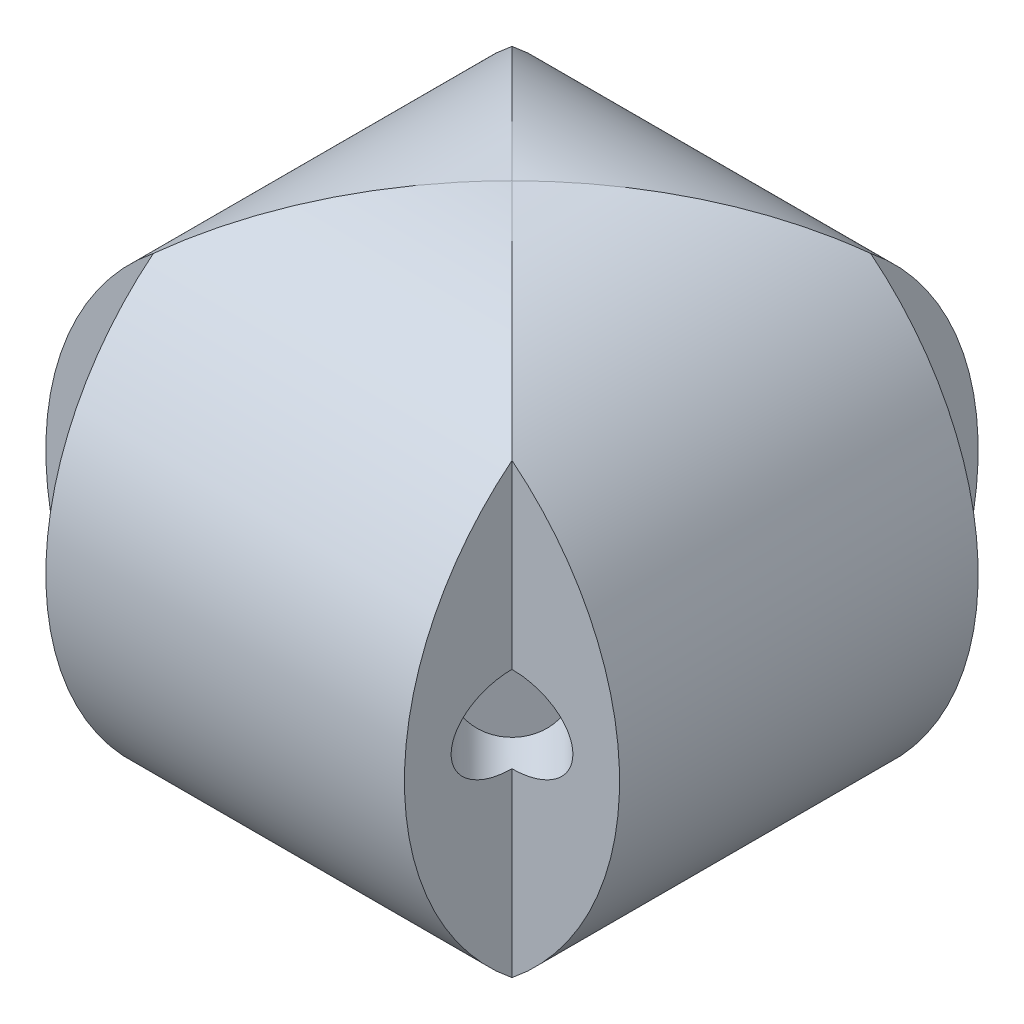
ISO-10303-21;
HEADER;
FILE_DESCRIPTION(('STEP AP214'),'2;1');
FILE_NAME('part.step','',(''),(''),'','','');
FILE_SCHEMA(('AUTOMOTIVE_DESIGN { 1 0 10303 214 1 1 1 1 }'));
ENDSEC;
DATA;
#1=APPLICATION_CONTEXT('core data for automotive mechanical design processes');
#2=APPLICATION_PROTOCOL_DEFINITION('international standard','automotive_design',2000,#1);
#3=PRODUCT_CONTEXT('',#1,'mechanical');
#4=PRODUCT('Part','Part','',(#3));
#5=PRODUCT_RELATED_PRODUCT_CATEGORY('part','',(#4));
#6=PRODUCT_DEFINITION_FORMATION('','',#4);
#7=PRODUCT_DEFINITION_CONTEXT('part definition',#1,'design');
#8=PRODUCT_DEFINITION('design','',#6,#7);
#9=PRODUCT_DEFINITION_SHAPE('','',#8);
#10=(LENGTH_UNIT() NAMED_UNIT(*) SI_UNIT(.MILLI.,.METRE.));
#11=(NAMED_UNIT(*) PLANE_ANGLE_UNIT() SI_UNIT($,.RADIAN.));
#12=(NAMED_UNIT(*) SI_UNIT($,.STERADIAN.) SOLID_ANGLE_UNIT());
#13=UNCERTAINTY_MEASURE_WITH_UNIT(LENGTH_MEASURE(1.E-05),#10,'distance_accuracy_value','');
#14=(GEOMETRIC_REPRESENTATION_CONTEXT(3) GLOBAL_UNCERTAINTY_ASSIGNED_CONTEXT((#13)) GLOBAL_UNIT_ASSIGNED_CONTEXT((#10,
#11,#12)) REPRESENTATION_CONTEXT('',''));
#15=CARTESIAN_POINT('',(0.,0.,0.));
#16=DIRECTION('',(0.,0.,1.));
#17=DIRECTION('',(1.,0.,0.));
#18=AXIS2_PLACEMENT_3D('',#15,#16,#17);
#19=CARTESIAN_POINT('',(-55.2478642454349,0.,0.));
#20=DIRECTION('',(-1.,0.,0.));
#21=DIRECTION('',(0.,0.,1.));
#22=AXIS2_PLACEMENT_3D('',#19,#20,#21);
#23=CYLINDRICAL_SURFACE('',#22,20.);
#24=CARTESIAN_POINT('',(12.5,0.,0.));
#25=DIRECTION('',(-1.,0.,0.));
#26=DIRECTION('',(0.,0.,1.));
#27=AXIS2_PLACEMENT_3D('',#24,#25,#26);
#28=CIRCLE('',#27,20.);
#29=CARTESIAN_POINT('',(12.5,15.612494995996,-12.5));
#30=VERTEX_POINT('',#29);
#31=CARTESIAN_POINT('',(12.5,-15.612494995996,-12.5));
#32=VERTEX_POINT('',#31);
#33=EDGE_CURVE('E147',#30,#32,#28,.T.);
#34=ORIENTED_EDGE('',*,*,#33,.T.);
#35=CARTESIAN_POINT('',(0.,0.,0.));
#36=DIRECTION('',(-0.707106781186547,0.,-0.707106781186547));
#37=DIRECTION('',(-0.707106781186547,0.,0.707106781186547));
#38=AXIS2_PLACEMENT_3D('',#35,#36,#37);
#39=ELLIPSE('',#38,28.2842712474619,20.);
#40=CARTESIAN_POINT('',(0.,-20.,0.));
#41=VERTEX_POINT('',#40);
#42=EDGE_CURVE('E161',#41,#32,#39,.F.);
#43=ORIENTED_EDGE('',*,*,#42,.F.);
#44=CARTESIAN_POINT('',(0.,0.,0.));
#45=DIRECTION('',(-0.707106781186547,0.,0.707106781186547));
#46=DIRECTION('',(-0.707106781186547,0.,-0.707106781186547));
#47=AXIS2_PLACEMENT_3D('',#44,#45,#46);
#48=ELLIPSE('',#47,28.2842712474619,20.);
#49=CARTESIAN_POINT('',(-12.5,-15.612494995996,-12.5));
#50=VERTEX_POINT('',#49);
#51=EDGE_CURVE('E151',#50,#41,#48,.T.);
#52=ORIENTED_EDGE('',*,*,#51,.F.);
#53=CARTESIAN_POINT('',(-12.5,0.,0.));
#54=DIRECTION('',(-1.,0.,0.));
#55=DIRECTION('',(0.,0.,1.));
#56=AXIS2_PLACEMENT_3D('',#53,#54,#55);
#57=CIRCLE('',#56,20.);
#58=CARTESIAN_POINT('',(-12.5,15.612494995996,-12.5));
#59=VERTEX_POINT('',#58);
#60=EDGE_CURVE('E145',#59,#50,#57,.T.);
#61=ORIENTED_EDGE('',*,*,#60,.F.);
#62=CARTESIAN_POINT('',(0.,20.,0.));
#63=VERTEX_POINT('',#62);
#64=EDGE_CURVE('E154',#63,#59,#48,.T.);
#65=ORIENTED_EDGE('',*,*,#64,.F.);
#66=EDGE_CURVE('E158',#30,#63,#39,.F.);
#67=ORIENTED_EDGE('',*,*,#66,.F.);
#68=EDGE_LOOP('',(#34,#43,#52,#61,#65,#67));
#69=FACE_BOUND('',#68,.T.);
#70=ADVANCED_FACE('F33',(#69),#23,.T.);
#71=CARTESIAN_POINT('',(0.,0.,-44.0023131290348));
#72=DIRECTION('',(0.,0.,-1.));
#73=DIRECTION('',(-1.,0.,0.));
#74=AXIS2_PLACEMENT_3D('',#71,#72,#73);
#75=CYLINDRICAL_SURFACE('',#74,20.);
#76=CARTESIAN_POINT('',(0.,0.,12.5));
#77=DIRECTION('',(0.,0.,-1.));
#78=DIRECTION('',(-1.,0.,0.));
#79=AXIS2_PLACEMENT_3D('',#76,#77,#78);
#80=CIRCLE('',#79,20.);
#81=CARTESIAN_POINT('',(12.5,15.612494995996,12.5));
#82=VERTEX_POINT('',#81);
#83=CARTESIAN_POINT('',(12.5,-15.612494995996,12.5));
#84=VERTEX_POINT('',#83);
#85=EDGE_CURVE('E141',#82,#84,#80,.T.);
#86=ORIENTED_EDGE('',*,*,#85,.T.);
#87=CARTESIAN_POINT('',(0.,0.,0.));
#88=DIRECTION('',(-0.707106781186547,0.,0.707106781186547));
#89=DIRECTION('',(-0.707106781186547,0.,-0.707106781186547));
#90=AXIS2_PLACEMENT_3D('',#87,#88,#89);
#91=ELLIPSE('',#90,28.2842712474619,20.);
#92=EDGE_CURVE('E148',#84,#41,#91,.F.);
#93=ORIENTED_EDGE('',*,*,#92,.T.);
#94=ORIENTED_EDGE('',*,*,#42,.T.);
#95=CARTESIAN_POINT('',(0.,0.,-12.5));
#96=DIRECTION('',(0.,0.,-1.));
#97=DIRECTION('',(-1.,0.,0.));
#98=AXIS2_PLACEMENT_3D('',#95,#96,#97);
#99=CIRCLE('',#98,20.);
#100=EDGE_CURVE('E137',#30,#32,#99,.T.);
#101=ORIENTED_EDGE('',*,*,#100,.F.);
#102=ORIENTED_EDGE('',*,*,#66,.T.);
#103=EDGE_CURVE('E152',#63,#82,#91,.F.);
#104=ORIENTED_EDGE('',*,*,#103,.T.);
#105=EDGE_LOOP('',(#86,#93,#94,#101,#102,#104));
#106=FACE_BOUND('',#105,.T.);
#107=ADVANCED_FACE('F193',(#106),#75,.T.);
#108=CARTESIAN_POINT('',(-12.5,-15.612494995996,12.5));
#109=VERTEX_POINT('',#108);
#110=CARTESIAN_POINT('',(-12.5,15.612494995996,12.5));
#111=VERTEX_POINT('',#110);
#112=EDGE_CURVE('E138',#109,#111,#80,.T.);
#113=ORIENTED_EDGE('',*,*,#112,.T.);
#114=CARTESIAN_POINT('',(0.,0.,0.));
#115=DIRECTION('',(-0.707106781186547,0.,-0.707106781186547));
#116=DIRECTION('',(-0.707106781186547,0.,0.707106781186547));
#117=AXIS2_PLACEMENT_3D('',#114,#115,#116);
#118=ELLIPSE('',#117,28.2842712474619,20.);
#119=EDGE_CURVE('E155',#111,#63,#118,.T.);
#120=ORIENTED_EDGE('',*,*,#119,.T.);
#121=ORIENTED_EDGE('',*,*,#64,.T.);
#122=EDGE_CURVE('E134',#50,#59,#99,.T.);
#123=ORIENTED_EDGE('',*,*,#122,.F.);
#124=ORIENTED_EDGE('',*,*,#51,.T.);
#125=EDGE_CURVE('E159',#41,#109,#118,.T.);
#126=ORIENTED_EDGE('',*,*,#125,.T.);
#127=EDGE_LOOP('',(#113,#120,#121,#123,#124,#126));
#128=FACE_BOUND('',#127,.T.);
#129=ADVANCED_FACE('F185',(#128),#75,.T.);
#130=EDGE_CURVE('E116',#84,#82,#28,.T.);
#131=ORIENTED_EDGE('',*,*,#130,.T.);
#132=ORIENTED_EDGE('',*,*,#103,.F.);
#133=ORIENTED_EDGE('',*,*,#119,.F.);
#134=EDGE_CURVE('E142',#109,#111,#57,.T.);
#135=ORIENTED_EDGE('',*,*,#134,.F.);
#136=ORIENTED_EDGE('',*,*,#125,.F.);
#137=ORIENTED_EDGE('',*,*,#92,.F.);
#138=EDGE_LOOP('',(#131,#132,#133,#135,#136,#137));
#139=FACE_BOUND('',#138,.T.);
#140=ADVANCED_FACE('F180',(#139),#23,.T.);
#141=CARTESIAN_POINT('',(20.,-29.8048183902927,12.5));
#142=DIRECTION('',(0.,0.,-1.));
#143=DIRECTION('',(0.,1.,0.));
#144=AXIS2_PLACEMENT_3D('',#141,#142,#143);
#145=PLANE('',#144);
#146=CARTESIAN_POINT('',(12.5,0.,12.5));
#147=DIRECTION('',(0.,0.,-1.));
#148=DIRECTION('',(-1.,0.,0.));
#149=AXIS2_PLACEMENT_3D('',#146,#147,#148);
#150=ELLIPSE('',#149,4.24264068711929,3.);
#151=CARTESIAN_POINT('',(12.5,-3.,12.5));
#152=VERTEX_POINT('',#151);
#153=CARTESIAN_POINT('',(12.5,3.,12.5));
#154=VERTEX_POINT('',#153);
#155=EDGE_CURVE('E45',#152,#154,#150,.F.);
#156=ORIENTED_EDGE('',*,*,#155,.F.);
#157=DIRECTION('',(0.,1.,0.));
#158=VECTOR('',#157,1.);
#159=CARTESIAN_POINT('',(12.5,-29.8048183902927,12.5));
#160=LINE('',#159,#158);
#161=EDGE_CURVE('E107',#84,#152,#160,.T.);
#162=ORIENTED_EDGE('',*,*,#161,.F.);
#163=ORIENTED_EDGE('',*,*,#85,.F.);
#164=EDGE_CURVE('E109',#154,#82,#160,.T.);
#165=ORIENTED_EDGE('',*,*,#164,.F.);
#166=EDGE_LOOP('',(#156,#162,#163,#165));
#167=FACE_BOUND('',#166,.T.);
#168=ADVANCED_FACE('F105',(#167),#145,.F.);
#169=CARTESIAN_POINT('',(12.5,-29.8048183902927,12.5));
#170=DIRECTION('',(-1.,0.,0.));
#171=DIRECTION('',(0.,-1.,0.));
#172=AXIS2_PLACEMENT_3D('',#169,#170,#171);
#173=PLANE('',#172);
#174=CARTESIAN_POINT('',(12.5,0.,12.5));
#175=DIRECTION('',(-1.,0.,0.));
#176=DIRECTION('',(0.,0.,-1.));
#177=AXIS2_PLACEMENT_3D('',#174,#175,#176);
#178=ELLIPSE('',#177,4.24264068711928,3.);
#179=EDGE_CURVE('E11',#154,#152,#178,.F.);
#180=ORIENTED_EDGE('',*,*,#179,.F.);
#181=ORIENTED_EDGE('',*,*,#164,.T.);
#182=ORIENTED_EDGE('',*,*,#130,.F.);
#183=ORIENTED_EDGE('',*,*,#161,.T.);
#184=EDGE_LOOP('',(#180,#181,#182,#183));
#185=FACE_BOUND('',#184,.T.);
#186=ADVANCED_FACE('F114',(#185),#173,.F.);
#187=CARTESIAN_POINT('',(-20.,-29.8048183902927,12.5));
#188=DIRECTION('',(0.,0.,-1.));
#189=DIRECTION('',(-1.,0.,0.));
#190=AXIS2_PLACEMENT_3D('',#187,#188,#189);
#191=PLANE('',#190);
#192=CARTESIAN_POINT('',(-12.5,0.,12.5));
#193=DIRECTION('',(0.,0.,-1.));
#194=DIRECTION('',(-1.,0.,0.));
#195=AXIS2_PLACEMENT_3D('',#192,#193,#194);
#196=ELLIPSE('',#195,4.24264068711928,3.);
#197=CARTESIAN_POINT('',(-12.5,3.,12.5));
#198=VERTEX_POINT('',#197);
#199=CARTESIAN_POINT('',(-12.5,-3.,12.5));
#200=VERTEX_POINT('',#199);
#201=EDGE_CURVE('E52',#198,#200,#196,.F.);
#202=ORIENTED_EDGE('',*,*,#201,.F.);
#203=DIRECTION('',(0.,1.,0.));
#204=VECTOR('',#203,1.);
#205=CARTESIAN_POINT('',(-12.5,-29.8048183902927,12.5));
#206=LINE('',#205,#204);
#207=EDGE_CURVE('E117',#198,#111,#206,.T.);
#208=ORIENTED_EDGE('',*,*,#207,.T.);
#209=ORIENTED_EDGE('',*,*,#112,.F.);
#210=EDGE_CURVE('E119',#109,#200,#206,.T.);
#211=ORIENTED_EDGE('',*,*,#210,.T.);
#212=EDGE_LOOP('',(#202,#208,#209,#211));
#213=FACE_BOUND('',#212,.T.);
#214=ADVANCED_FACE('F170',(#213),#191,.F.);
#215=CARTESIAN_POINT('',(-12.5,-29.8048183902927,12.5));
#216=DIRECTION('',(1.,0.,0.));
#217=DIRECTION('',(0.,1.,0.));
#218=AXIS2_PLACEMENT_3D('',#215,#216,#217);
#219=PLANE('',#218);
#220=CARTESIAN_POINT('',(-12.5,0.,12.5));
#221=DIRECTION('',(1.,0.,0.));
#222=DIRECTION('',(0.,0.,1.));
#223=AXIS2_PLACEMENT_3D('',#220,#221,#222);
#224=ELLIPSE('',#223,4.24264068711928,3.);
#225=EDGE_CURVE('E40',#200,#198,#224,.F.);
#226=ORIENTED_EDGE('',*,*,#225,.F.);
#227=ORIENTED_EDGE('',*,*,#210,.F.);
#228=ORIENTED_EDGE('',*,*,#134,.T.);
#229=ORIENTED_EDGE('',*,*,#207,.F.);
#230=EDGE_LOOP('',(#226,#227,#228,#229));
#231=FACE_BOUND('',#230,.T.);
#232=ADVANCED_FACE('F173',(#231),#219,.F.);
#233=CARTESIAN_POINT('',(-12.5,-29.8048183902927,-12.5));
#234=DIRECTION('',(0.,0.,1.));
#235=DIRECTION('',(1.,0.,0.));
#236=AXIS2_PLACEMENT_3D('',#233,#234,#235);
#237=PLANE('',#236);
#238=CARTESIAN_POINT('',(-12.5,0.,-12.5));
#239=DIRECTION('',(0.,0.,1.));
#240=DIRECTION('',(1.,0.,0.));
#241=AXIS2_PLACEMENT_3D('',#238,#239,#240);
#242=ELLIPSE('',#241,4.24264068711928,3.);
#243=CARTESIAN_POINT('',(-12.5,-3.,-12.5));
#244=VERTEX_POINT('',#243);
#245=CARTESIAN_POINT('',(-12.5,3.00000000000001,-12.5));
#246=VERTEX_POINT('',#245);
#247=EDGE_CURVE('E121',#244,#246,#242,.F.);
#248=ORIENTED_EDGE('',*,*,#247,.F.);
#249=DIRECTION('',(0.,1.,0.));
#250=VECTOR('',#249,1.);
#251=CARTESIAN_POINT('',(-12.5,-29.8048183902927,-12.5));
#252=LINE('',#251,#250);
#253=EDGE_CURVE('E131',#50,#244,#252,.T.);
#254=ORIENTED_EDGE('',*,*,#253,.F.);
#255=ORIENTED_EDGE('',*,*,#122,.T.);
#256=EDGE_CURVE('E127',#246,#59,#252,.T.);
#257=ORIENTED_EDGE('',*,*,#256,.F.);
#258=EDGE_LOOP('',(#248,#254,#255,#257));
#259=FACE_BOUND('',#258,.T.);
#260=ADVANCED_FACE('F243',(#259),#237,.F.);
#261=CARTESIAN_POINT('',(-12.5,-29.8048183902927,-20.));
#262=DIRECTION('',(1.,0.,0.));
#263=DIRECTION('',(0.,0.,-1.));
#264=AXIS2_PLACEMENT_3D('',#261,#262,#263);
#265=PLANE('',#264);
#266=CARTESIAN_POINT('',(-12.5,0.,-12.5));
#267=DIRECTION('',(1.,0.,0.));
#268=DIRECTION('',(0.,0.,1.));
#269=AXIS2_PLACEMENT_3D('',#266,#267,#268);
#270=ELLIPSE('',#269,4.24264068711929,3.);
#271=EDGE_CURVE('E162',#246,#244,#270,.F.);
#272=ORIENTED_EDGE('',*,*,#271,.F.);
#273=ORIENTED_EDGE('',*,*,#256,.T.);
#274=ORIENTED_EDGE('',*,*,#60,.T.);
#275=ORIENTED_EDGE('',*,*,#253,.T.);
#276=EDGE_LOOP('',(#272,#273,#274,#275));
#277=FACE_BOUND('',#276,.T.);
#278=ADVANCED_FACE('F246',(#277),#265,.F.);
#279=CARTESIAN_POINT('',(12.5,-29.8048183902927,-12.5));
#280=DIRECTION('',(0.,0.,1.));
#281=DIRECTION('',(0.,-1.,0.));
#282=AXIS2_PLACEMENT_3D('',#279,#280,#281);
#283=PLANE('',#282);
#284=CARTESIAN_POINT('',(12.5,0.,-12.5));
#285=DIRECTION('',(0.,0.,1.));
#286=DIRECTION('',(1.,0.,0.));
#287=AXIS2_PLACEMENT_3D('',#284,#285,#286);
#288=ELLIPSE('',#287,4.24264068711928,3.);
#289=CARTESIAN_POINT('',(12.5,3.,-12.5));
#290=VERTEX_POINT('',#289);
#291=CARTESIAN_POINT('',(12.5,-3.,-12.5));
#292=VERTEX_POINT('',#291);
#293=EDGE_CURVE('E208',#290,#292,#288,.F.);
#294=ORIENTED_EDGE('',*,*,#293,.F.);
#295=DIRECTION('',(0.,1.,0.));
#296=VECTOR('',#295,1.);
#297=CARTESIAN_POINT('',(12.5,-29.8048183902927,-12.5));
#298=LINE('',#297,#296);
#299=EDGE_CURVE('E128',#290,#30,#298,.T.);
#300=ORIENTED_EDGE('',*,*,#299,.T.);
#301=ORIENTED_EDGE('',*,*,#100,.T.);
#302=EDGE_CURVE('E125',#32,#292,#298,.T.);
#303=ORIENTED_EDGE('',*,*,#302,.T.);
#304=EDGE_LOOP('',(#294,#300,#301,#303));
#305=FACE_BOUND('',#304,.T.);
#306=ADVANCED_FACE('F203',(#305),#283,.F.);
#307=CARTESIAN_POINT('',(12.5,-29.8048183902927,-22.400213331479));
#308=DIRECTION('',(-1.,0.,0.));
#309=DIRECTION('',(0.,-1.,0.));
#310=AXIS2_PLACEMENT_3D('',#307,#308,#309);
#311=PLANE('',#310);
#312=CARTESIAN_POINT('',(12.5,0.,-12.5));
#313=DIRECTION('',(-1.,0.,0.));
#314=DIRECTION('',(0.,0.,-1.));
#315=AXIS2_PLACEMENT_3D('',#312,#313,#314);
#316=ELLIPSE('',#315,4.24264068711928,3.);
#317=EDGE_CURVE('E164',#292,#290,#316,.F.);
#318=ORIENTED_EDGE('',*,*,#317,.F.);
#319=ORIENTED_EDGE('',*,*,#302,.F.);
#320=ORIENTED_EDGE('',*,*,#33,.F.);
#321=ORIENTED_EDGE('',*,*,#299,.F.);
#322=EDGE_LOOP('',(#318,#319,#320,#321));
#323=FACE_BOUND('',#322,.T.);
#324=ADVANCED_FACE('F205',(#323),#311,.F.);
#325=CARTESIAN_POINT('',(17.7372633615603,0.,17.7372633615603));
#326=DIRECTION('',(0.707106781186548,0.,0.707106781186547));
#327=DIRECTION('',(0.707106781186547,0.,-0.707106781186548));
#328=AXIS2_PLACEMENT_3D('',#325,#326,#327);
#329=CYLINDRICAL_SURFACE('',#328,3.);
#330=CARTESIAN_POINT('',(-10.6066017177982,0.,-10.6066017177982));
#331=DIRECTION('',(0.707106781186548,0.,0.707106781186547));
#332=DIRECTION('',(0.707106781186547,0.,-0.707106781186548));
#333=AXIS2_PLACEMENT_3D('',#330,#331,#332);
#334=CIRCLE('',#333,3.);
#335=CARTESIAN_POINT('',(-8.48528137423857,0.,-12.7279220613579));
#336=VERTEX_POINT('',#335);
#337=EDGE_CURVE('E209',#336,#336,#334,.T.);
#338=ORIENTED_EDGE('',*,*,#337,.T.);
#339=EDGE_LOOP('',(#338));
#340=FACE_BOUND('',#339,.T.);
#341=ORIENTED_EDGE('',*,*,#247,.T.);
#342=ORIENTED_EDGE('',*,*,#271,.T.);
#343=EDGE_LOOP('',(#341,#342));
#344=FACE_BOUND('',#343,.T.);
#345=ADVANCED_FACE('F257',(#340,#344),#329,.F.);
#346=CARTESIAN_POINT('',(-10.6066017177982,0.,-10.6066017177982));
#347=DIRECTION('',(-0.707106781186548,0.,-0.707106781186547));
#348=DIRECTION('',(-0.707106781186547,0.,0.707106781186548));
#349=AXIS2_PLACEMENT_3D('',#346,#347,#348);
#350=PLANE('',#349);
#351=ORIENTED_EDGE('',*,*,#337,.F.);
#352=EDGE_LOOP('',(#351));
#353=FACE_BOUND('',#352,.T.);
#354=ADVANCED_FACE('F262',(#353),#350,.T.);
#355=CARTESIAN_POINT('',(17.6525986199672,0.,-17.6525986199672));
#356=DIRECTION('',(0.707106781186548,0.,-0.707106781186547));
#357=DIRECTION('',(-0.707106781186547,0.,-0.707106781186548));
#358=AXIS2_PLACEMENT_3D('',#355,#356,#357);
#359=CYLINDRICAL_SURFACE('',#358,3.);
#360=CARTESIAN_POINT('',(10.6066017177982,0.,-10.6066017177982));
#361=DIRECTION('',(0.707106781186548,0.,-0.707106781186547));
#362=DIRECTION('',(-0.707106781186547,0.,-0.707106781186548));
#363=AXIS2_PLACEMENT_3D('',#360,#361,#362);
#364=CIRCLE('',#363,3.);
#365=CARTESIAN_POINT('',(8.48528137423857,0.,-12.7279220613579));
#366=VERTEX_POINT('',#365);
#367=EDGE_CURVE('E171',#366,#366,#364,.T.);
#368=ORIENTED_EDGE('',*,*,#367,.F.);
#369=EDGE_LOOP('',(#368));
#370=FACE_BOUND('',#369,.T.);
#371=ORIENTED_EDGE('',*,*,#293,.T.);
#372=ORIENTED_EDGE('',*,*,#317,.T.);
#373=EDGE_LOOP('',(#371,#372));
#374=FACE_BOUND('',#373,.T.);
#375=ADVANCED_FACE('F207',(#370,#374),#359,.F.);
#376=CARTESIAN_POINT('',(10.6066017177982,0.,-10.6066017177982));
#377=DIRECTION('',(0.707106781186548,0.,-0.707106781186547));
#378=DIRECTION('',(-0.707106781186547,0.,-0.707106781186548));
#379=AXIS2_PLACEMENT_3D('',#376,#377,#378);
#380=PLANE('',#379);
#381=ORIENTED_EDGE('',*,*,#367,.T.);
#382=EDGE_LOOP('',(#381));
#383=FACE_BOUND('',#382,.T.);
#384=ADVANCED_FACE('F269',(#383),#380,.T.);
#385=CARTESIAN_POINT('',(-18.9225697437443,0.,18.9225697437443));
#386=DIRECTION('',(-0.707106781186548,0.,0.707106781186547));
#387=DIRECTION('',(0.707106781186547,0.,0.707106781186548));
#388=AXIS2_PLACEMENT_3D('',#385,#386,#387);
#389=CYLINDRICAL_SURFACE('',#388,3.);
#390=CARTESIAN_POINT('',(-10.6066017177982,0.,10.6066017177982));
#391=DIRECTION('',(-0.707106781186548,0.,0.707106781186547));
#392=DIRECTION('',(0.707106781186547,0.,0.707106781186548));
#393=AXIS2_PLACEMENT_3D('',#390,#391,#392);
#394=CIRCLE('',#393,3.);
#395=CARTESIAN_POINT('',(-8.48528137423857,0.,12.7279220613579));
#396=VERTEX_POINT('',#395);
#397=EDGE_CURVE('E110',#396,#396,#394,.T.);
#398=ORIENTED_EDGE('',*,*,#397,.F.);
#399=EDGE_LOOP('',(#398));
#400=FACE_BOUND('',#399,.T.);
#401=ORIENTED_EDGE('',*,*,#201,.T.);
#402=ORIENTED_EDGE('',*,*,#225,.T.);
#403=EDGE_LOOP('',(#401,#402));
#404=FACE_BOUND('',#403,.T.);
#405=ADVANCED_FACE('F165',(#400,#404),#389,.F.);
#406=CARTESIAN_POINT('',(-10.6066017177982,0.,10.6066017177982));
#407=DIRECTION('',(-0.707106781186548,0.,0.707106781186547));
#408=DIRECTION('',(0.707106781186547,0.,0.707106781186548));
#409=AXIS2_PLACEMENT_3D('',#406,#407,#408);
#410=PLANE('',#409);
#411=ORIENTED_EDGE('',*,*,#397,.T.);
#412=EDGE_LOOP('',(#411));
#413=FACE_BOUND('',#412,.T.);
#414=ADVANCED_FACE('F227',(#413),#410,.T.);
#415=CARTESIAN_POINT('',(0.,0.,0.));
#416=DIRECTION('',(-0.707106781186548,0.,-0.707106781186547));
#417=DIRECTION('',(-0.707106781186547,0.,0.707106781186548));
#418=AXIS2_PLACEMENT_3D('',#415,#416,#417);
#419=CYLINDRICAL_SURFACE('',#418,3.);
#420=CARTESIAN_POINT('',(10.6066017177982,0.,10.6066017177982));
#421=DIRECTION('',(-0.707106781186548,0.,-0.707106781186547));
#422=DIRECTION('',(-0.707106781186547,0.,0.707106781186548));
#423=AXIS2_PLACEMENT_3D('',#420,#421,#422);
#424=CIRCLE('',#423,3.);
#425=CARTESIAN_POINT('',(8.48528137423857,0.,12.7279220613579));
#426=VERTEX_POINT('',#425);
#427=EDGE_CURVE('E111',#426,#426,#424,.T.);
#428=ORIENTED_EDGE('',*,*,#427,.T.);
#429=EDGE_LOOP('',(#428));
#430=FACE_BOUND('',#429,.T.);
#431=ORIENTED_EDGE('',*,*,#155,.T.);
#432=ORIENTED_EDGE('',*,*,#179,.T.);
#433=EDGE_LOOP('',(#431,#432));
#434=FACE_BOUND('',#433,.T.);
#435=ADVANCED_FACE('F99',(#430,#434),#419,.F.);
#436=CARTESIAN_POINT('',(10.6066017177982,0.,10.6066017177982));
#437=DIRECTION('',(0.707106781186548,0.,0.707106781186547));
#438=DIRECTION('',(0.707106781186547,0.,-0.707106781186548));
#439=AXIS2_PLACEMENT_3D('',#436,#437,#438);
#440=PLANE('',#439);
#441=ORIENTED_EDGE('',*,*,#427,.F.);
#442=EDGE_LOOP('',(#441));
#443=FACE_BOUND('',#442,.T.);
#444=ADVANCED_FACE('F221',(#443),#440,.T.);
#445=CLOSED_SHELL('',(#70,#107,#129,#140,#168,#186,#214,#232,#260,#278,#306,#324,#345,#354,#375,
#384,#405,#414,#435,#444));
#446=MANIFOLD_SOLID_BREP('B2',#445);
#447=ADVANCED_BREP_SHAPE_REPRESENTATION('',(#18,#446),#14);
#448=SHAPE_DEFINITION_REPRESENTATION(#9,#447);
ENDSEC;
END-ISO-10303-21;
